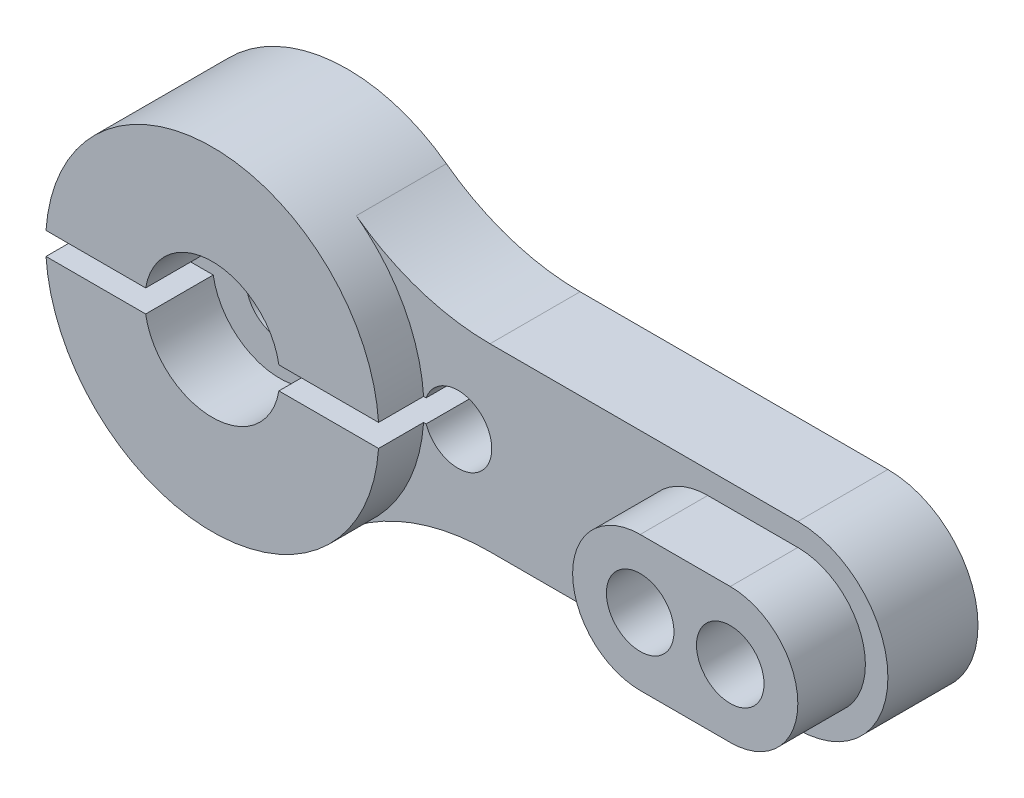
ISO-10303-21;
HEADER;
FILE_DESCRIPTION(('STEP AP214'),'2;1');
FILE_NAME('part.step','',(''),(''),'','','');
FILE_SCHEMA(('AUTOMOTIVE_DESIGN { 1 0 10303 214 1 1 1 1 }'));
ENDSEC;
DATA;
#1=APPLICATION_CONTEXT('core data for automotive mechanical design processes');
#2=APPLICATION_PROTOCOL_DEFINITION('international standard','automotive_design',2000,#1);
#3=PRODUCT_CONTEXT('',#1,'mechanical');
#4=PRODUCT('Part','Part','',(#3));
#5=PRODUCT_RELATED_PRODUCT_CATEGORY('part','',(#4));
#6=PRODUCT_DEFINITION_FORMATION('','',#4);
#7=PRODUCT_DEFINITION_CONTEXT('part definition',#1,'design');
#8=PRODUCT_DEFINITION('design','',#6,#7);
#9=PRODUCT_DEFINITION_SHAPE('','',#8);
#10=(LENGTH_UNIT() NAMED_UNIT(*) SI_UNIT(.MILLI.,.METRE.));
#11=(NAMED_UNIT(*) PLANE_ANGLE_UNIT() SI_UNIT($,.RADIAN.));
#12=(NAMED_UNIT(*) SI_UNIT($,.STERADIAN.) SOLID_ANGLE_UNIT());
#13=UNCERTAINTY_MEASURE_WITH_UNIT(LENGTH_MEASURE(1.E-05),#10,'distance_accuracy_value','');
#14=(GEOMETRIC_REPRESENTATION_CONTEXT(3) GLOBAL_UNCERTAINTY_ASSIGNED_CONTEXT((#13)) GLOBAL_UNIT_ASSIGNED_CONTEXT((#10,
#11,#12)) REPRESENTATION_CONTEXT('',''));
#15=CARTESIAN_POINT('',(0.,0.,0.));
#16=DIRECTION('',(0.,0.,1.));
#17=DIRECTION('',(1.,0.,0.));
#18=AXIS2_PLACEMENT_3D('',#15,#16,#17);
#19=CARTESIAN_POINT('',(0.,0.,7.));
#20=DIRECTION('',(0.,0.,-1.));
#21=DIRECTION('',(-1.,0.,0.));
#22=AXIS2_PLACEMENT_3D('',#19,#20,#21);
#23=CYLINDRICAL_SURFACE('',#22,1.5);
#24=CARTESIAN_POINT('',(0.,0.,1.5));
#25=DIRECTION('',(0.,0.,-1.));
#26=DIRECTION('',(-1.,0.,0.));
#27=AXIS2_PLACEMENT_3D('',#24,#25,#26);
#28=CIRCLE('',#27,1.5);
#29=CARTESIAN_POINT('',(1.4142135623731,0.5,1.5));
#30=VERTEX_POINT('',#29);
#31=CARTESIAN_POINT('',(1.4142135623731,-0.5,1.5));
#32=VERTEX_POINT('',#31);
#33=EDGE_CURVE('E82',#30,#32,#28,.F.);
#34=ORIENTED_EDGE('',*,*,#33,.F.);
#35=DIRECTION('',(0.,0.,-1.));
#36=VECTOR('',#35,1.);
#37=CARTESIAN_POINT('',(1.4142135623731,0.5,7.));
#38=LINE('',#37,#36);
#39=CARTESIAN_POINT('',(1.4142135623731,0.5,3.));
#40=VERTEX_POINT('',#39);
#41=EDGE_CURVE('E257',#40,#30,#38,.T.);
#42=ORIENTED_EDGE('',*,*,#41,.F.);
#43=CARTESIAN_POINT('',(0.,0.,3.));
#44=DIRECTION('',(0.,0.,1.));
#45=DIRECTION('',(1.,0.,0.));
#46=AXIS2_PLACEMENT_3D('',#43,#44,#45);
#47=CIRCLE('',#46,1.5);
#48=CARTESIAN_POINT('',(1.4142135623731,-0.5,3.));
#49=VERTEX_POINT('',#48);
#50=EDGE_CURVE('E424',#40,#49,#47,.T.);
#51=ORIENTED_EDGE('',*,*,#50,.T.);
#52=DIRECTION('',(0.,0.,-1.));
#53=VECTOR('',#52,1.);
#54=CARTESIAN_POINT('',(1.4142135623731,-0.5,7.));
#55=LINE('',#54,#53);
#56=EDGE_CURVE('E254',#49,#32,#55,.T.);
#57=ORIENTED_EDGE('',*,*,#56,.T.);
#58=EDGE_LOOP('',(#34,#42,#51,#57));
#59=FACE_BOUND('',#58,.T.);
#60=ADVANCED_FACE('F74',(#59),#23,.F.);
#61=CARTESIAN_POINT('',(0.,0.,6.));
#62=DIRECTION('',(0.,0.,1.));
#63=DIRECTION('',(1.,0.,0.));
#64=AXIS2_PLACEMENT_3D('',#61,#62,#63);
#65=PLANE('',#64);
#66=DIRECTION('',(-1.,0.,0.));
#67=VECTOR('',#66,1.);
#68=CARTESIAN_POINT('',(-2.95803989154981,0.499999999999999,6.));
#69=LINE('',#68,#67);
#70=CARTESIAN_POINT('',(-2.95803989154981,0.499999999999999,6.));
#71=VERTEX_POINT('',#70);
#72=CARTESIAN_POINT('',(-7.38308878451289,0.5,6.));
#73=VERTEX_POINT('',#72);
#74=EDGE_CURVE('E291',#71,#73,#69,.T.);
#75=ORIENTED_EDGE('',*,*,#74,.F.);
#76=CARTESIAN_POINT('',(0.,0.,6.));
#77=DIRECTION('',(0.,0.,1.));
#78=DIRECTION('',(1.,0.,0.));
#79=AXIS2_PLACEMENT_3D('',#76,#77,#78);
#80=CIRCLE('',#79,3.);
#81=CARTESIAN_POINT('',(2.95803989154981,0.499999999999999,6.));
#82=VERTEX_POINT('',#81);
#83=EDGE_CURVE('E303',#82,#71,#80,.T.);
#84=ORIENTED_EDGE('',*,*,#83,.F.);
#85=DIRECTION('',(-1.,0.,0.));
#86=VECTOR('',#85,1.);
#87=CARTESIAN_POINT('',(0.,0.499999999999999,6.));
#88=LINE('',#87,#86);
#89=CARTESIAN_POINT('',(7.38308878451289,0.499999999999998,6.));
#90=VERTEX_POINT('',#89);
#91=EDGE_CURVE('E420',#90,#82,#88,.T.);
#92=ORIENTED_EDGE('',*,*,#91,.F.);
#93=CARTESIAN_POINT('',(0.,0.,6.));
#94=DIRECTION('',(0.,0.,1.));
#95=DIRECTION('',(1.,0.,0.));
#96=AXIS2_PLACEMENT_3D('',#93,#94,#95);
#97=CIRCLE('',#96,7.4);
#98=EDGE_CURVE('E370',#90,#73,#97,.T.);
#99=ORIENTED_EDGE('',*,*,#98,.T.);
#100=EDGE_LOOP('',(#75,#84,#92,#99));
#101=FACE_BOUND('',#100,.T.);
#102=ADVANCED_FACE('F479',(#101),#65,.T.);
#103=CARTESIAN_POINT('',(10.3324730824716,-14.,4.));
#104=DIRECTION('',(0.,0.,-1.));
#105=DIRECTION('',(-1.,0.,0.));
#106=AXIS2_PLACEMENT_3D('',#103,#104,#105);
#107=PLANE('',#106);
#108=DIRECTION('',(1.,0.,0.));
#109=VECTOR('',#108,1.);
#110=CARTESIAN_POINT('',(10.3324730824716,0.499999999999999,4.));
#111=LINE('',#110,#109);
#112=CARTESIAN_POINT('',(7.38308878451289,0.499999999999998,4.));
#113=VERTEX_POINT('',#112);
#114=CARTESIAN_POINT('',(7.49578643762691,0.5,4.));
#115=VERTEX_POINT('',#114);
#116=EDGE_CURVE('E326',#113,#115,#111,.T.);
#117=ORIENTED_EDGE('',*,*,#116,.T.);
#118=CARTESIAN_POINT('',(8.91,0.,4.));
#119=DIRECTION('',(0.,0.,-1.));
#120=DIRECTION('',(-1.,0.,0.));
#121=AXIS2_PLACEMENT_3D('',#118,#119,#120);
#122=CIRCLE('',#121,1.5);
#123=CARTESIAN_POINT('',(7.4957864376269,-0.5,4.));
#124=VERTEX_POINT('',#123);
#125=EDGE_CURVE('E271',#115,#124,#122,.T.);
#126=ORIENTED_EDGE('',*,*,#125,.T.);
#127=DIRECTION('',(-1.,0.,0.));
#128=VECTOR('',#127,1.);
#129=CARTESIAN_POINT('',(10.3324730824716,-0.499999999999999,4.));
#130=LINE('',#129,#128);
#131=CARTESIAN_POINT('',(7.38308878451289,-0.499999999999998,4.));
#132=VERTEX_POINT('',#131);
#133=EDGE_CURVE('E320',#124,#132,#130,.T.);
#134=ORIENTED_EDGE('',*,*,#133,.T.);
#135=CARTESIAN_POINT('',(0.,0.,4.));
#136=DIRECTION('',(0.,0.,1.));
#137=DIRECTION('',(1.,0.,0.));
#138=AXIS2_PLACEMENT_3D('',#135,#136,#137);
#139=CIRCLE('',#138,7.4);
#140=CARTESIAN_POINT('',(4.39427016151091,-5.95402298850575,4.));
#141=VERTEX_POINT('',#140);
#142=EDGE_CURVE('E371',#141,#132,#139,.T.);
#143=ORIENTED_EDGE('',*,*,#142,.F.);
#144=CARTESIAN_POINT('',(10.3324730824716,-14.,4.));
#145=DIRECTION('',(0.,0.,-1.));
#146=DIRECTION('',(-1.,0.,0.));
#147=AXIS2_PLACEMENT_3D('',#144,#145,#146);
#148=CIRCLE('',#147,10.);
#149=CARTESIAN_POINT('',(10.3324730824716,-4.,4.));
#150=VERTEX_POINT('',#149);
#151=EDGE_CURVE('E376',#141,#150,#148,.T.);
#152=ORIENTED_EDGE('',*,*,#151,.T.);
#153=DIRECTION('',(1.,0.,0.));
#154=VECTOR('',#153,1.);
#155=CARTESIAN_POINT('',(24.,-4.,4.));
#156=LINE('',#155,#154);
#157=CARTESIAN_POINT('',(24.,-4.,4.));
#158=VERTEX_POINT('',#157);
#159=EDGE_CURVE('E379',#150,#158,#156,.T.);
#160=ORIENTED_EDGE('',*,*,#159,.T.);
#161=CARTESIAN_POINT('',(24.,0.,4.));
#162=DIRECTION('',(0.,0.,1.));
#163=DIRECTION('',(1.,0.,0.));
#164=AXIS2_PLACEMENT_3D('',#161,#162,#163);
#165=CIRCLE('',#164,4.);
#166=CARTESIAN_POINT('',(24.,4.,4.));
#167=VERTEX_POINT('',#166);
#168=EDGE_CURVE('E382',#158,#167,#165,.T.);
#169=ORIENTED_EDGE('',*,*,#168,.T.);
#170=DIRECTION('',(-1.,0.,0.));
#171=VECTOR('',#170,1.);
#172=CARTESIAN_POINT('',(24.,4.,4.));
#173=LINE('',#172,#171);
#174=CARTESIAN_POINT('',(10.3324730824716,4.,4.));
#175=VERTEX_POINT('',#174);
#176=EDGE_CURVE('E384',#167,#175,#173,.T.);
#177=ORIENTED_EDGE('',*,*,#176,.T.);
#178=CARTESIAN_POINT('',(10.3324730824716,14.,4.));
#179=DIRECTION('',(0.,0.,-1.));
#180=DIRECTION('',(-1.,0.,0.));
#181=AXIS2_PLACEMENT_3D('',#178,#179,#180);
#182=CIRCLE('',#181,10.);
#183=CARTESIAN_POINT('',(4.3942701615109,5.95402298850575,4.));
#184=VERTEX_POINT('',#183);
#185=EDGE_CURVE('E386',#175,#184,#182,.T.);
#186=ORIENTED_EDGE('',*,*,#185,.T.);
#187=EDGE_CURVE('E375',#113,#184,#139,.T.);
#188=ORIENTED_EDGE('',*,*,#187,.F.);
#189=EDGE_LOOP('',(#117,#126,#134,#143,#152,#160,#169,#177,#186,#188));
#190=FACE_BOUND('',#189,.T.);
#191=CARTESIAN_POINT('',(24.,0.,4.));
#192=DIRECTION('',(0.,0.,1.));
#193=DIRECTION('',(1.,0.,0.));
#194=AXIS2_PLACEMENT_3D('',#191,#192,#193);
#195=CIRCLE('',#194,3.);
#196=CARTESIAN_POINT('',(24.,-3.,4.));
#197=VERTEX_POINT('',#196);
#198=CARTESIAN_POINT('',(24.,3.,4.));
#199=VERTEX_POINT('',#198);
#200=EDGE_CURVE('E334',#197,#199,#195,.T.);
#201=ORIENTED_EDGE('',*,*,#200,.F.);
#202=DIRECTION('',(1.,0.,0.));
#203=VECTOR('',#202,1.);
#204=CARTESIAN_POINT('',(24.,-3.,4.));
#205=LINE('',#204,#203);
#206=CARTESIAN_POINT('',(20.,-3.,4.));
#207=VERTEX_POINT('',#206);
#208=EDGE_CURVE('E339',#207,#197,#205,.T.);
#209=ORIENTED_EDGE('',*,*,#208,.F.);
#210=CARTESIAN_POINT('',(20.,0.,4.));
#211=DIRECTION('',(0.,0.,1.));
#212=DIRECTION('',(1.,0.,0.));
#213=AXIS2_PLACEMENT_3D('',#210,#211,#212);
#214=CIRCLE('',#213,3.);
#215=CARTESIAN_POINT('',(20.,3.,4.));
#216=VERTEX_POINT('',#215);
#217=EDGE_CURVE('E351',#216,#207,#214,.T.);
#218=ORIENTED_EDGE('',*,*,#217,.F.);
#219=DIRECTION('',(-1.,0.,0.));
#220=VECTOR('',#219,1.);
#221=CARTESIAN_POINT('',(24.,3.,4.));
#222=LINE('',#221,#220);
#223=EDGE_CURVE('E348',#199,#216,#222,.T.);
#224=ORIENTED_EDGE('',*,*,#223,.F.);
#225=EDGE_LOOP('',(#201,#209,#218,#224));
#226=FACE_BOUND('',#225,.T.);
#227=ADVANCED_FACE('F455',(#190,#226),#107,.F.);
#228=CARTESIAN_POINT('',(10.3324730824716,-14.,4.));
#229=DIRECTION('',(0.,0.,-1.));
#230=DIRECTION('',(-1.,0.,0.));
#231=AXIS2_PLACEMENT_3D('',#228,#229,#230);
#232=CYLINDRICAL_SURFACE('',#231,10.);
#233=CARTESIAN_POINT('',(10.3324730824716,-14.,0.));
#234=DIRECTION('',(0.,0.,-1.));
#235=DIRECTION('',(-1.,0.,0.));
#236=AXIS2_PLACEMENT_3D('',#233,#234,#235);
#237=CIRCLE('',#236,10.);
#238=CARTESIAN_POINT('',(4.39427016151091,-5.95402298850575,0.));
#239=VERTEX_POINT('',#238);
#240=CARTESIAN_POINT('',(10.3324730824716,-4.,0.));
#241=VERTEX_POINT('',#240);
#242=EDGE_CURVE('E390',#239,#241,#237,.T.);
#243=ORIENTED_EDGE('',*,*,#242,.T.);
#244=DIRECTION('',(0.,0.,-1.));
#245=VECTOR('',#244,1.);
#246=CARTESIAN_POINT('',(10.3324730824716,-4.,4.));
#247=LINE('',#246,#245);
#248=EDGE_CURVE('E416',#150,#241,#247,.T.);
#249=ORIENTED_EDGE('',*,*,#248,.F.);
#250=ORIENTED_EDGE('',*,*,#151,.F.);
#251=DIRECTION('',(0.,0.,-1.));
#252=VECTOR('',#251,1.);
#253=CARTESIAN_POINT('',(4.39427016151091,-5.95402298850575,4.));
#254=LINE('',#253,#252);
#255=EDGE_CURVE('E389',#141,#239,#254,.T.);
#256=ORIENTED_EDGE('',*,*,#255,.T.);
#257=EDGE_LOOP('',(#243,#249,#250,#256));
#258=FACE_BOUND('',#257,.T.);
#259=ADVANCED_FACE('F76',(#258),#232,.F.);
#260=CARTESIAN_POINT('',(24.,-4.,4.));
#261=DIRECTION('',(0.,1.,0.));
#262=DIRECTION('',(-1.,0.,0.));
#263=AXIS2_PLACEMENT_3D('',#260,#261,#262);
#264=PLANE('',#263);
#265=DIRECTION('',(1.,0.,0.));
#266=VECTOR('',#265,1.);
#267=CARTESIAN_POINT('',(24.,-4.,0.));
#268=LINE('',#267,#266);
#269=CARTESIAN_POINT('',(24.,-4.,0.));
#270=VERTEX_POINT('',#269);
#271=EDGE_CURVE('E393',#241,#270,#268,.T.);
#272=ORIENTED_EDGE('',*,*,#271,.T.);
#273=DIRECTION('',(0.,0.,-1.));
#274=VECTOR('',#273,1.);
#275=CARTESIAN_POINT('',(24.,-4.,4.));
#276=LINE('',#275,#274);
#277=EDGE_CURVE('E413',#158,#270,#276,.T.);
#278=ORIENTED_EDGE('',*,*,#277,.F.);
#279=ORIENTED_EDGE('',*,*,#159,.F.);
#280=ORIENTED_EDGE('',*,*,#248,.T.);
#281=EDGE_LOOP('',(#272,#278,#279,#280));
#282=FACE_BOUND('',#281,.T.);
#283=ADVANCED_FACE('F513',(#282),#264,.F.);
#284=CARTESIAN_POINT('',(24.,0.,4.));
#285=DIRECTION('',(0.,0.,-1.));
#286=DIRECTION('',(-1.,0.,0.));
#287=AXIS2_PLACEMENT_3D('',#284,#285,#286);
#288=CYLINDRICAL_SURFACE('',#287,4.);
#289=CARTESIAN_POINT('',(24.,0.,0.));
#290=DIRECTION('',(0.,0.,1.));
#291=DIRECTION('',(1.,0.,0.));
#292=AXIS2_PLACEMENT_3D('',#289,#290,#291);
#293=CIRCLE('',#292,4.);
#294=CARTESIAN_POINT('',(24.,4.,0.));
#295=VERTEX_POINT('',#294);
#296=EDGE_CURVE('E395',#270,#295,#293,.T.);
#297=ORIENTED_EDGE('',*,*,#296,.T.);
#298=DIRECTION('',(0.,0.,-1.));
#299=VECTOR('',#298,1.);
#300=CARTESIAN_POINT('',(24.,4.,4.));
#301=LINE('',#300,#299);
#302=EDGE_CURVE('E410',#167,#295,#301,.T.);
#303=ORIENTED_EDGE('',*,*,#302,.F.);
#304=ORIENTED_EDGE('',*,*,#168,.F.);
#305=ORIENTED_EDGE('',*,*,#277,.T.);
#306=EDGE_LOOP('',(#297,#303,#304,#305));
#307=FACE_BOUND('',#306,.T.);
#308=ADVANCED_FACE('F510',(#307),#288,.T.);
#309=CARTESIAN_POINT('',(24.,4.,4.));
#310=DIRECTION('',(0.,-1.,0.));
#311=DIRECTION('',(1.,0.,0.));
#312=AXIS2_PLACEMENT_3D('',#309,#310,#311);
#313=PLANE('',#312);
#314=DIRECTION('',(-1.,0.,0.));
#315=VECTOR('',#314,1.);
#316=CARTESIAN_POINT('',(24.,4.,0.));
#317=LINE('',#316,#315);
#318=CARTESIAN_POINT('',(10.3324730824716,4.,0.));
#319=VERTEX_POINT('',#318);
#320=EDGE_CURVE('E397',#295,#319,#317,.T.);
#321=ORIENTED_EDGE('',*,*,#320,.T.);
#322=DIRECTION('',(0.,0.,-1.));
#323=VECTOR('',#322,1.);
#324=CARTESIAN_POINT('',(10.3324730824716,4.,4.));
#325=LINE('',#324,#323);
#326=EDGE_CURVE('E407',#175,#319,#325,.T.);
#327=ORIENTED_EDGE('',*,*,#326,.F.);
#328=ORIENTED_EDGE('',*,*,#176,.F.);
#329=ORIENTED_EDGE('',*,*,#302,.T.);
#330=EDGE_LOOP('',(#321,#327,#328,#329));
#331=FACE_BOUND('',#330,.T.);
#332=ADVANCED_FACE('F506',(#331),#313,.F.);
#333=CARTESIAN_POINT('',(10.3324730824716,14.,4.));
#334=DIRECTION('',(0.,0.,-1.));
#335=DIRECTION('',(-1.,0.,0.));
#336=AXIS2_PLACEMENT_3D('',#333,#334,#335);
#337=CYLINDRICAL_SURFACE('',#336,10.);
#338=CARTESIAN_POINT('',(10.3324730824716,14.,0.));
#339=DIRECTION('',(0.,0.,-1.));
#340=DIRECTION('',(-1.,0.,0.));
#341=AXIS2_PLACEMENT_3D('',#338,#339,#340);
#342=CIRCLE('',#341,10.);
#343=CARTESIAN_POINT('',(4.3942701615109,5.95402298850575,0.));
#344=VERTEX_POINT('',#343);
#345=EDGE_CURVE('E399',#319,#344,#342,.T.);
#346=ORIENTED_EDGE('',*,*,#345,.T.);
#347=DIRECTION('',(0.,0.,-1.));
#348=VECTOR('',#347,1.);
#349=CARTESIAN_POINT('',(4.3942701615109,5.95402298850575,4.));
#350=LINE('',#349,#348);
#351=EDGE_CURVE('E404',#184,#344,#350,.T.);
#352=ORIENTED_EDGE('',*,*,#351,.F.);
#353=ORIENTED_EDGE('',*,*,#185,.F.);
#354=ORIENTED_EDGE('',*,*,#326,.T.);
#355=EDGE_LOOP('',(#346,#352,#353,#354));
#356=FACE_BOUND('',#355,.T.);
#357=ADVANCED_FACE('F501',(#356),#337,.F.);
#358=CARTESIAN_POINT('',(0.,0.,4.));
#359=DIRECTION('',(0.,0.,-1.));
#360=DIRECTION('',(-1.,0.,0.));
#361=AXIS2_PLACEMENT_3D('',#358,#359,#360);
#362=CYLINDRICAL_SURFACE('',#361,7.4);
#363=ORIENTED_EDGE('',*,*,#98,.F.);
#364=DIRECTION('',(0.,0.,-1.));
#365=VECTOR('',#364,1.);
#366=CARTESIAN_POINT('',(7.38308878451289,0.499999999999998,4.));
#367=LINE('',#366,#365);
#368=EDGE_CURVE('E323',#90,#113,#367,.T.);
#369=ORIENTED_EDGE('',*,*,#368,.T.);
#370=ORIENTED_EDGE('',*,*,#187,.T.);
#371=ORIENTED_EDGE('',*,*,#351,.T.);
#372=CARTESIAN_POINT('',(0.,0.,0.));
#373=DIRECTION('',(0.,0.,1.));
#374=DIRECTION('',(1.,0.,0.));
#375=AXIS2_PLACEMENT_3D('',#372,#373,#374);
#376=CIRCLE('',#375,7.4);
#377=EDGE_CURVE('E380',#344,#239,#376,.T.);
#378=ORIENTED_EDGE('',*,*,#377,.T.);
#379=ORIENTED_EDGE('',*,*,#255,.F.);
#380=ORIENTED_EDGE('',*,*,#142,.T.);
#381=DIRECTION('',(0.,0.,-1.));
#382=VECTOR('',#381,1.);
#383=CARTESIAN_POINT('',(7.38308878451289,-0.499999999999998,4.));
#384=LINE('',#383,#382);
#385=CARTESIAN_POINT('',(7.38308878451289,-0.499999999999998,6.));
#386=VERTEX_POINT('',#385);
#387=EDGE_CURVE('E310',#132,#386,#384,.F.);
#388=ORIENTED_EDGE('',*,*,#387,.T.);
#389=CARTESIAN_POINT('',(-7.38308878451289,-0.5,6.));
#390=VERTEX_POINT('',#389);
#391=EDGE_CURVE('E367',#390,#386,#97,.T.);
#392=ORIENTED_EDGE('',*,*,#391,.F.);
#393=DIRECTION('',(0.,0.,-1.));
#394=VECTOR('',#393,1.);
#395=CARTESIAN_POINT('',(-7.38308878451289,-0.5,4.));
#396=LINE('',#395,#394);
#397=CARTESIAN_POINT('',(-7.38308878451289,-0.5,3.));
#398=VERTEX_POINT('',#397);
#399=EDGE_CURVE('E331',#390,#398,#396,.T.);
#400=ORIENTED_EDGE('',*,*,#399,.T.);
#401=CARTESIAN_POINT('',(0.,0.,3.));
#402=DIRECTION('',(0.,0.,1.));
#403=DIRECTION('',(1.,0.,0.));
#404=AXIS2_PLACEMENT_3D('',#401,#402,#403);
#405=CIRCLE('',#404,7.4);
#406=CARTESIAN_POINT('',(-7.38308878451289,0.5,3.));
#407=VERTEX_POINT('',#406);
#408=EDGE_CURVE('E422',#407,#398,#405,.T.);
#409=ORIENTED_EDGE('',*,*,#408,.F.);
#410=DIRECTION('',(0.,0.,-1.));
#411=VECTOR('',#410,1.);
#412=CARTESIAN_POINT('',(-7.38308878451289,0.5,4.));
#413=LINE('',#412,#411);
#414=EDGE_CURVE('E328',#407,#73,#413,.F.);
#415=ORIENTED_EDGE('',*,*,#414,.T.);
#416=EDGE_LOOP('',(#363,#369,#370,#371,#378,#379,#380,#388,#392,#400,#409,#415));
#417=FACE_BOUND('',#416,.T.);
#418=ADVANCED_FACE('F451',(#417),#362,.T.);
#419=CARTESIAN_POINT('',(10.3324730824716,-14.,0.));
#420=DIRECTION('',(0.,0.,-1.));
#421=DIRECTION('',(-1.,0.,0.));
#422=AXIS2_PLACEMENT_3D('',#419,#420,#421);
#423=PLANE('',#422);
#424=CARTESIAN_POINT('',(0.,0.,0.));
#425=DIRECTION('',(0.,0.,-1.));
#426=DIRECTION('',(-1.,0.,0.));
#427=AXIS2_PLACEMENT_3D('',#424,#425,#426);
#428=CIRCLE('',#427,3.925);
#429=CARTESIAN_POINT('',(3.89302260460943,-0.499999999999999,0.));
#430=VERTEX_POINT('',#429);
#431=CARTESIAN_POINT('',(3.89302260460943,0.499999999999999,0.));
#432=VERTEX_POINT('',#431);
#433=EDGE_CURVE('E236',#430,#432,#428,.T.);
#434=ORIENTED_EDGE('',*,*,#433,.F.);
#435=DIRECTION('',(1.,0.,0.));
#436=VECTOR('',#435,1.);
#437=CARTESIAN_POINT('',(0.,-0.5,0.));
#438=LINE('',#437,#436);
#439=CARTESIAN_POINT('',(7.4957864376269,-0.5,0.));
#440=VERTEX_POINT('',#439);
#441=EDGE_CURVE('E97',#430,#440,#438,.T.);
#442=ORIENTED_EDGE('',*,*,#441,.T.);
#443=CARTESIAN_POINT('',(8.91,0.,0.));
#444=DIRECTION('',(0.,0.,-1.));
#445=DIRECTION('',(-1.,0.,0.));
#446=AXIS2_PLACEMENT_3D('',#443,#444,#445);
#447=CIRCLE('',#446,1.5);
#448=CARTESIAN_POINT('',(7.49578643762691,0.5,0.));
#449=VERTEX_POINT('',#448);
#450=EDGE_CURVE('E253',#449,#440,#447,.T.);
#451=ORIENTED_EDGE('',*,*,#450,.F.);
#452=DIRECTION('',(1.,0.,0.));
#453=VECTOR('',#452,1.);
#454=CARTESIAN_POINT('',(0.,0.5,0.));
#455=LINE('',#454,#453);
#456=EDGE_CURVE('E247',#432,#449,#455,.T.);
#457=ORIENTED_EDGE('',*,*,#456,.F.);
#458=EDGE_LOOP('',(#434,#442,#451,#457));
#459=FACE_BOUND('',#458,.T.);
#460=CARTESIAN_POINT('',(24.,0.,0.));
#461=DIRECTION('',(0.,0.,1.));
#462=DIRECTION('',(-1.,0.,0.));
#463=AXIS2_PLACEMENT_3D('',#460,#461,#462);
#464=CIRCLE('',#463,1.5);
#465=CARTESIAN_POINT('',(22.5,0.,0.));
#466=VERTEX_POINT('',#465);
#467=EDGE_CURVE('E275',#466,#466,#464,.T.);
#468=ORIENTED_EDGE('',*,*,#467,.T.);
#469=EDGE_LOOP('',(#468));
#470=FACE_BOUND('',#469,.T.);
#471=CARTESIAN_POINT('',(20.,0.,0.));
#472=DIRECTION('',(0.,0.,1.));
#473=DIRECTION('',(1.,0.,0.));
#474=AXIS2_PLACEMENT_3D('',#471,#472,#473);
#475=CIRCLE('',#474,1.5);
#476=CARTESIAN_POINT('',(21.5,0.,0.));
#477=VERTEX_POINT('',#476);
#478=EDGE_CURVE('E281',#477,#477,#475,.T.);
#479=ORIENTED_EDGE('',*,*,#478,.T.);
#480=EDGE_LOOP('',(#479));
#481=FACE_BOUND('',#480,.T.);
#482=ORIENTED_EDGE('',*,*,#242,.F.);
#483=ORIENTED_EDGE('',*,*,#377,.F.);
#484=ORIENTED_EDGE('',*,*,#345,.F.);
#485=ORIENTED_EDGE('',*,*,#320,.F.);
#486=ORIENTED_EDGE('',*,*,#296,.F.);
#487=ORIENTED_EDGE('',*,*,#271,.F.);
#488=EDGE_LOOP('',(#482,#483,#484,#485,#486,#487));
#489=FACE_BOUND('',#488,.T.);
#490=ADVANCED_FACE('F251',(#459,#470,#481,#489),#423,.T.);
#491=DIRECTION('',(1.,0.,0.));
#492=VECTOR('',#491,1.);
#493=CARTESIAN_POINT('',(0.,-0.499999999999999,6.));
#494=LINE('',#493,#492);
#495=CARTESIAN_POINT('',(-2.95803989154981,-0.499999999999999,6.));
#496=VERTEX_POINT('',#495);
#497=EDGE_CURVE('E374',#390,#496,#494,.T.);
#498=ORIENTED_EDGE('',*,*,#497,.F.);
#499=ORIENTED_EDGE('',*,*,#391,.T.);
#500=DIRECTION('',(1.,0.,0.));
#501=VECTOR('',#500,1.);
#502=CARTESIAN_POINT('',(7.39999999999997,-0.499999999999998,6.));
#503=LINE('',#502,#501);
#504=CARTESIAN_POINT('',(2.95803989154981,-0.499999999999999,6.));
#505=VERTEX_POINT('',#504);
#506=EDGE_CURVE('E301',#505,#386,#503,.T.);
#507=ORIENTED_EDGE('',*,*,#506,.F.);
#508=CARTESIAN_POINT('',(0.,0.,6.));
#509=DIRECTION('',(0.,0.,1.));
#510=DIRECTION('',(1.,0.,0.));
#511=AXIS2_PLACEMENT_3D('',#508,#509,#510);
#512=CIRCLE('',#511,3.);
#513=EDGE_CURVE('E284',#496,#505,#512,.T.);
#514=ORIENTED_EDGE('',*,*,#513,.F.);
#515=EDGE_LOOP('',(#498,#499,#507,#514));
#516=FACE_BOUND('',#515,.T.);
#517=ADVANCED_FACE('F447',(#516),#65,.T.);
#518=CARTESIAN_POINT('',(24.,0.,7.));
#519=DIRECTION('',(0.,0.,-1.));
#520=DIRECTION('',(-1.,0.,0.));
#521=AXIS2_PLACEMENT_3D('',#518,#519,#520);
#522=CYLINDRICAL_SURFACE('',#521,3.);
#523=ORIENTED_EDGE('',*,*,#200,.T.);
#524=DIRECTION('',(0.,0.,-1.));
#525=VECTOR('',#524,1.);
#526=CARTESIAN_POINT('',(24.,3.,7.));
#527=LINE('',#526,#525);
#528=CARTESIAN_POINT('',(24.,3.,7.));
#529=VERTEX_POINT('',#528);
#530=EDGE_CURVE('E364',#529,#199,#527,.T.);
#531=ORIENTED_EDGE('',*,*,#530,.F.);
#532=CARTESIAN_POINT('',(24.,0.,7.));
#533=DIRECTION('',(0.,0.,1.));
#534=DIRECTION('',(1.,0.,0.));
#535=AXIS2_PLACEMENT_3D('',#532,#533,#534);
#536=CIRCLE('',#535,3.);
#537=CARTESIAN_POINT('',(24.,-3.,7.));
#538=VERTEX_POINT('',#537);
#539=EDGE_CURVE('E335',#538,#529,#536,.T.);
#540=ORIENTED_EDGE('',*,*,#539,.F.);
#541=DIRECTION('',(0.,0.,-1.));
#542=VECTOR('',#541,1.);
#543=CARTESIAN_POINT('',(24.,-3.,7.));
#544=LINE('',#543,#542);
#545=EDGE_CURVE('E345',#538,#197,#544,.T.);
#546=ORIENTED_EDGE('',*,*,#545,.T.);
#547=EDGE_LOOP('',(#523,#531,#540,#546));
#548=FACE_BOUND('',#547,.T.);
#549=ADVANCED_FACE('F490',(#548),#522,.T.);
#550=CARTESIAN_POINT('',(24.,3.,7.));
#551=DIRECTION('',(0.,-1.,0.));
#552=DIRECTION('',(0.,0.,-1.));
#553=AXIS2_PLACEMENT_3D('',#550,#551,#552);
#554=PLANE('',#553);
#555=ORIENTED_EDGE('',*,*,#223,.T.);
#556=DIRECTION('',(0.,0.,-1.));
#557=VECTOR('',#556,1.);
#558=CARTESIAN_POINT('',(20.,3.,7.));
#559=LINE('',#558,#557);
#560=CARTESIAN_POINT('',(20.,3.,7.));
#561=VERTEX_POINT('',#560);
#562=EDGE_CURVE('E361',#561,#216,#559,.T.);
#563=ORIENTED_EDGE('',*,*,#562,.F.);
#564=DIRECTION('',(-1.,0.,0.));
#565=VECTOR('',#564,1.);
#566=CARTESIAN_POINT('',(24.,3.,7.));
#567=LINE('',#566,#565);
#568=EDGE_CURVE('E338',#529,#561,#567,.T.);
#569=ORIENTED_EDGE('',*,*,#568,.F.);
#570=ORIENTED_EDGE('',*,*,#530,.T.);
#571=EDGE_LOOP('',(#555,#563,#569,#570));
#572=FACE_BOUND('',#571,.T.);
#573=ADVANCED_FACE('F495',(#572),#554,.F.);
#574=CARTESIAN_POINT('',(20.,0.,7.));
#575=DIRECTION('',(0.,0.,-1.));
#576=DIRECTION('',(-1.,0.,0.));
#577=AXIS2_PLACEMENT_3D('',#574,#575,#576);
#578=CYLINDRICAL_SURFACE('',#577,3.);
#579=ORIENTED_EDGE('',*,*,#217,.T.);
#580=DIRECTION('',(0.,0.,-1.));
#581=VECTOR('',#580,1.);
#582=CARTESIAN_POINT('',(20.,-3.,7.));
#583=LINE('',#582,#581);
#584=CARTESIAN_POINT('',(20.,-3.,7.));
#585=VERTEX_POINT('',#584);
#586=EDGE_CURVE('E358',#585,#207,#583,.T.);
#587=ORIENTED_EDGE('',*,*,#586,.F.);
#588=CARTESIAN_POINT('',(20.,0.,7.));
#589=DIRECTION('',(0.,0.,1.));
#590=DIRECTION('',(1.,0.,0.));
#591=AXIS2_PLACEMENT_3D('',#588,#589,#590);
#592=CIRCLE('',#591,3.);
#593=EDGE_CURVE('E341',#561,#585,#592,.T.);
#594=ORIENTED_EDGE('',*,*,#593,.F.);
#595=ORIENTED_EDGE('',*,*,#562,.T.);
#596=EDGE_LOOP('',(#579,#587,#594,#595));
#597=FACE_BOUND('',#596,.T.);
#598=ADVANCED_FACE('F656',(#597),#578,.T.);
#599=CARTESIAN_POINT('',(24.,-3.,7.));
#600=DIRECTION('',(0.,1.,0.));
#601=DIRECTION('',(-1.,0.,0.));
#602=AXIS2_PLACEMENT_3D('',#599,#600,#601);
#603=PLANE('',#602);
#604=ORIENTED_EDGE('',*,*,#208,.T.);
#605=ORIENTED_EDGE('',*,*,#545,.F.);
#606=DIRECTION('',(1.,0.,0.));
#607=VECTOR('',#606,1.);
#608=CARTESIAN_POINT('',(24.,-3.,7.));
#609=LINE('',#608,#607);
#610=EDGE_CURVE('E343',#585,#538,#609,.T.);
#611=ORIENTED_EDGE('',*,*,#610,.F.);
#612=ORIENTED_EDGE('',*,*,#586,.T.);
#613=EDGE_LOOP('',(#604,#605,#611,#612));
#614=FACE_BOUND('',#613,.T.);
#615=ADVANCED_FACE('F652',(#614),#603,.F.);
#616=CARTESIAN_POINT('',(24.,0.,7.));
#617=DIRECTION('',(0.,0.,1.));
#618=DIRECTION('',(1.,0.,0.));
#619=AXIS2_PLACEMENT_3D('',#616,#617,#618);
#620=PLANE('',#619);
#621=CARTESIAN_POINT('',(24.,0.,7.));
#622=DIRECTION('',(0.,0.,1.));
#623=DIRECTION('',(-1.,0.,0.));
#624=AXIS2_PLACEMENT_3D('',#621,#622,#623);
#625=CIRCLE('',#624,1.5);
#626=CARTESIAN_POINT('',(22.5,0.,7.));
#627=VERTEX_POINT('',#626);
#628=EDGE_CURVE('E274',#627,#627,#625,.T.);
#629=ORIENTED_EDGE('',*,*,#628,.F.);
#630=EDGE_LOOP('',(#629));
#631=FACE_BOUND('',#630,.T.);
#632=CARTESIAN_POINT('',(20.,0.,7.));
#633=DIRECTION('',(0.,0.,1.));
#634=DIRECTION('',(1.,0.,0.));
#635=AXIS2_PLACEMENT_3D('',#632,#633,#634);
#636=CIRCLE('',#635,1.5);
#637=CARTESIAN_POINT('',(21.5,0.,7.));
#638=VERTEX_POINT('',#637);
#639=EDGE_CURVE('E278',#638,#638,#636,.T.);
#640=ORIENTED_EDGE('',*,*,#639,.F.);
#641=EDGE_LOOP('',(#640));
#642=FACE_BOUND('',#641,.T.);
#643=ORIENTED_EDGE('',*,*,#539,.T.);
#644=ORIENTED_EDGE('',*,*,#568,.T.);
#645=ORIENTED_EDGE('',*,*,#593,.T.);
#646=ORIENTED_EDGE('',*,*,#610,.T.);
#647=EDGE_LOOP('',(#643,#644,#645,#646));
#648=FACE_BOUND('',#647,.T.);
#649=ADVANCED_FACE('F561',(#631,#642,#648),#620,.T.);
#650=CARTESIAN_POINT('',(0.,0.,3.));
#651=DIRECTION('',(0.,0.,1.));
#652=DIRECTION('',(1.,0.,0.));
#653=AXIS2_PLACEMENT_3D('',#650,#651,#652);
#654=PLANE('',#653);
#655=DIRECTION('',(-1.,0.,0.));
#656=VECTOR('',#655,1.);
#657=CARTESIAN_POINT('',(0.,0.5,3.));
#658=LINE('',#657,#656);
#659=CARTESIAN_POINT('',(2.95803989154981,0.5,3.));
#660=VERTEX_POINT('',#659);
#661=EDGE_CURVE('E266',#660,#40,#658,.T.);
#662=ORIENTED_EDGE('',*,*,#661,.F.);
#663=CARTESIAN_POINT('',(0.,0.,3.));
#664=DIRECTION('',(0.,0.,1.));
#665=DIRECTION('',(1.,0.,0.));
#666=AXIS2_PLACEMENT_3D('',#663,#664,#665);
#667=CIRCLE('',#666,3.);
#668=CARTESIAN_POINT('',(-2.95803989154981,0.499999999999999,3.));
#669=VERTEX_POINT('',#668);
#670=EDGE_CURVE('E290',#660,#669,#667,.T.);
#671=ORIENTED_EDGE('',*,*,#670,.T.);
#672=DIRECTION('',(-1.,0.,0.));
#673=VECTOR('',#672,1.);
#674=CARTESIAN_POINT('',(-2.95803989154981,0.499999999999999,3.));
#675=LINE('',#674,#673);
#676=EDGE_CURVE('E294',#669,#407,#675,.T.);
#677=ORIENTED_EDGE('',*,*,#676,.T.);
#678=ORIENTED_EDGE('',*,*,#408,.T.);
#679=DIRECTION('',(1.,0.,0.));
#680=VECTOR('',#679,1.);
#681=CARTESIAN_POINT('',(-2.95803989154981,-0.499999999999999,3.));
#682=LINE('',#681,#680);
#683=CARTESIAN_POINT('',(-2.95803989154981,-0.499999999999999,3.));
#684=VERTEX_POINT('',#683);
#685=EDGE_CURVE('E297',#398,#684,#682,.T.);
#686=ORIENTED_EDGE('',*,*,#685,.T.);
#687=CARTESIAN_POINT('',(0.,0.,3.));
#688=DIRECTION('',(0.,0.,1.));
#689=DIRECTION('',(1.,0.,0.));
#690=AXIS2_PLACEMENT_3D('',#687,#688,#689);
#691=CIRCLE('',#690,3.);
#692=CARTESIAN_POINT('',(2.95803989154981,-0.5,3.));
#693=VERTEX_POINT('',#692);
#694=EDGE_CURVE('E287',#684,#693,#691,.T.);
#695=ORIENTED_EDGE('',*,*,#694,.T.);
#696=DIRECTION('',(-1.,0.,0.));
#697=VECTOR('',#696,1.);
#698=CARTESIAN_POINT('',(0.,-0.5,3.));
#699=LINE('',#698,#697);
#700=EDGE_CURVE('E268',#693,#49,#699,.T.);
#701=ORIENTED_EDGE('',*,*,#700,.T.);
#702=ORIENTED_EDGE('',*,*,#50,.F.);
#703=EDGE_LOOP('',(#662,#671,#677,#678,#686,#695,#701,#702));
#704=FACE_BOUND('',#703,.T.);
#705=ADVANCED_FACE('F436',(#704),#654,.T.);
#706=CARTESIAN_POINT('',(-2.95803989154981,-0.499999999999999,3.));
#707=DIRECTION('',(0.,-1.,0.));
#708=DIRECTION('',(1.,0.,0.));
#709=AXIS2_PLACEMENT_3D('',#706,#707,#708);
#710=PLANE('',#709);
#711=ORIENTED_EDGE('',*,*,#497,.T.);
#712=DIRECTION('',(0.,0.,1.));
#713=VECTOR('',#712,1.);
#714=CARTESIAN_POINT('',(-2.95803989154981,-0.499999999999999,3.));
#715=LINE('',#714,#713);
#716=EDGE_CURVE('E307',#684,#496,#715,.T.);
#717=ORIENTED_EDGE('',*,*,#716,.F.);
#718=ORIENTED_EDGE('',*,*,#685,.F.);
#719=ORIENTED_EDGE('',*,*,#399,.F.);
#720=EDGE_LOOP('',(#711,#717,#718,#719));
#721=FACE_BOUND('',#720,.T.);
#722=ADVANCED_FACE('F560',(#721),#710,.F.);
#723=CARTESIAN_POINT('',(-2.95803989154981,0.499999999999999,3.));
#724=DIRECTION('',(0.,1.,0.));
#725=DIRECTION('',(-1.,0.,0.));
#726=AXIS2_PLACEMENT_3D('',#723,#724,#725);
#727=PLANE('',#726);
#728=ORIENTED_EDGE('',*,*,#676,.F.);
#729=DIRECTION('',(0.,0.,1.));
#730=VECTOR('',#729,1.);
#731=CARTESIAN_POINT('',(-2.95803989154981,0.499999999999999,3.));
#732=LINE('',#731,#730);
#733=EDGE_CURVE('E311',#669,#71,#732,.T.);
#734=ORIENTED_EDGE('',*,*,#733,.T.);
#735=ORIENTED_EDGE('',*,*,#74,.T.);
#736=ORIENTED_EDGE('',*,*,#414,.F.);
#737=EDGE_LOOP('',(#728,#734,#735,#736));
#738=FACE_BOUND('',#737,.T.);
#739=ADVANCED_FACE('F475',(#738),#727,.F.);
#740=CARTESIAN_POINT('',(7.39999999999997,0.499999999999998,3.));
#741=DIRECTION('',(0.,1.,0.));
#742=DIRECTION('',(-1.,0.,0.));
#743=AXIS2_PLACEMENT_3D('',#740,#741,#742);
#744=PLANE('',#743);
#745=DIRECTION('',(-1.,0.,0.));
#746=VECTOR('',#745,1.);
#747=CARTESIAN_POINT('',(7.39999999999997,0.499999999999998,1.5));
#748=LINE('',#747,#746);
#749=CARTESIAN_POINT('',(3.89302260460943,0.499999999999999,1.5));
#750=VERTEX_POINT('',#749);
#751=EDGE_CURVE('E89',#750,#30,#748,.T.);
#752=ORIENTED_EDGE('',*,*,#751,.F.);
#753=DIRECTION('',(0.,0.,-1.));
#754=VECTOR('',#753,1.);
#755=CARTESIAN_POINT('',(3.89302260460943,0.499999999999999,1.5));
#756=LINE('',#755,#754);
#757=EDGE_CURVE('E240',#750,#432,#756,.T.);
#758=ORIENTED_EDGE('',*,*,#757,.T.);
#759=ORIENTED_EDGE('',*,*,#456,.T.);
#760=DIRECTION('',(0.,0.,-1.));
#761=VECTOR('',#760,1.);
#762=CARTESIAN_POINT('',(7.49578643762691,0.5,7.));
#763=LINE('',#762,#761);
#764=EDGE_CURVE('E261',#115,#449,#763,.T.);
#765=ORIENTED_EDGE('',*,*,#764,.F.);
#766=ORIENTED_EDGE('',*,*,#116,.F.);
#767=ORIENTED_EDGE('',*,*,#368,.F.);
#768=ORIENTED_EDGE('',*,*,#91,.T.);
#769=DIRECTION('',(0.,0.,1.));
#770=VECTOR('',#769,1.);
#771=CARTESIAN_POINT('',(2.95803989154981,0.499999999999999,3.));
#772=LINE('',#771,#770);
#773=EDGE_CURVE('E313',#660,#82,#772,.T.);
#774=ORIENTED_EDGE('',*,*,#773,.F.);
#775=ORIENTED_EDGE('',*,*,#661,.T.);
#776=ORIENTED_EDGE('',*,*,#41,.T.);
#777=EDGE_LOOP('',(#752,#758,#759,#765,#766,#767,#768,#774,#775,#776));
#778=FACE_BOUND('',#777,.T.);
#779=ADVANCED_FACE('F245',(#778),#744,.F.);
#780=CARTESIAN_POINT('',(7.39999999999997,-0.499999999999998,3.));
#781=DIRECTION('',(0.,-1.,0.));
#782=DIRECTION('',(1.,0.,0.));
#783=AXIS2_PLACEMENT_3D('',#780,#781,#782);
#784=PLANE('',#783);
#785=ORIENTED_EDGE('',*,*,#441,.F.);
#786=DIRECTION('',(0.,0.,-1.));
#787=VECTOR('',#786,1.);
#788=CARTESIAN_POINT('',(3.89302260460943,-0.499999999999999,1.5));
#789=LINE('',#788,#787);
#790=CARTESIAN_POINT('',(3.89302260460943,-0.499999999999999,1.5));
#791=VERTEX_POINT('',#790);
#792=EDGE_CURVE('E12',#430,#791,#789,.F.);
#793=ORIENTED_EDGE('',*,*,#792,.T.);
#794=DIRECTION('',(1.,0.,0.));
#795=VECTOR('',#794,1.);
#796=CARTESIAN_POINT('',(7.39999999999997,-0.499999999999998,1.5));
#797=LINE('',#796,#795);
#798=EDGE_CURVE('E427',#32,#791,#797,.T.);
#799=ORIENTED_EDGE('',*,*,#798,.F.);
#800=ORIENTED_EDGE('',*,*,#56,.F.);
#801=ORIENTED_EDGE('',*,*,#700,.F.);
#802=DIRECTION('',(0.,0.,1.));
#803=VECTOR('',#802,1.);
#804=CARTESIAN_POINT('',(2.95803989154981,-0.499999999999999,3.));
#805=LINE('',#804,#803);
#806=EDGE_CURVE('E299',#693,#505,#805,.T.);
#807=ORIENTED_EDGE('',*,*,#806,.T.);
#808=ORIENTED_EDGE('',*,*,#506,.T.);
#809=ORIENTED_EDGE('',*,*,#387,.F.);
#810=ORIENTED_EDGE('',*,*,#133,.F.);
#811=DIRECTION('',(0.,0.,-1.));
#812=VECTOR('',#811,1.);
#813=CARTESIAN_POINT('',(7.4957864376269,-0.5,7.));
#814=LINE('',#813,#812);
#815=EDGE_CURVE('E263',#124,#440,#814,.T.);
#816=ORIENTED_EDGE('',*,*,#815,.T.);
#817=EDGE_LOOP('',(#785,#793,#799,#800,#801,#807,#808,#809,#810,#816));
#818=FACE_BOUND('',#817,.T.);
#819=ADVANCED_FACE('F432',(#818),#784,.F.);
#820=CARTESIAN_POINT('',(0.,0.,3.));
#821=DIRECTION('',(0.,0.,1.));
#822=DIRECTION('',(1.,0.,0.));
#823=AXIS2_PLACEMENT_3D('',#820,#821,#822);
#824=CYLINDRICAL_SURFACE('',#823,3.);
#825=ORIENTED_EDGE('',*,*,#513,.T.);
#826=ORIENTED_EDGE('',*,*,#806,.F.);
#827=ORIENTED_EDGE('',*,*,#694,.F.);
#828=ORIENTED_EDGE('',*,*,#716,.T.);
#829=EDGE_LOOP('',(#825,#826,#827,#828));
#830=FACE_BOUND('',#829,.T.);
#831=ADVANCED_FACE('F442',(#830),#824,.F.);
#832=CARTESIAN_POINT('',(0.,0.,3.));
#833=DIRECTION('',(0.,0.,1.));
#834=DIRECTION('',(1.,0.,0.));
#835=AXIS2_PLACEMENT_3D('',#832,#833,#834);
#836=CYLINDRICAL_SURFACE('',#835,3.);
#837=ORIENTED_EDGE('',*,*,#83,.T.);
#838=ORIENTED_EDGE('',*,*,#733,.F.);
#839=ORIENTED_EDGE('',*,*,#670,.F.);
#840=ORIENTED_EDGE('',*,*,#773,.T.);
#841=EDGE_LOOP('',(#837,#838,#839,#840));
#842=FACE_BOUND('',#841,.T.);
#843=ADVANCED_FACE('F470',(#842),#836,.F.);
#844=CARTESIAN_POINT('',(20.,0.,0.));
#845=DIRECTION('',(0.,0.,1.));
#846=DIRECTION('',(1.,0.,0.));
#847=AXIS2_PLACEMENT_3D('',#844,#845,#846);
#848=CYLINDRICAL_SURFACE('',#847,1.5);
#849=ORIENTED_EDGE('',*,*,#478,.F.);
#850=EDGE_LOOP('',(#849));
#851=FACE_BOUND('',#850,.T.);
#852=ORIENTED_EDGE('',*,*,#639,.T.);
#853=EDGE_LOOP('',(#852));
#854=FACE_BOUND('',#853,.T.);
#855=ADVANCED_FACE('F584',(#851,#854),#848,.F.);
#856=CARTESIAN_POINT('',(24.,0.,0.));
#857=DIRECTION('',(0.,0.,1.));
#858=DIRECTION('',(1.,0.,0.));
#859=AXIS2_PLACEMENT_3D('',#856,#857,#858);
#860=CYLINDRICAL_SURFACE('',#859,1.5);
#861=ORIENTED_EDGE('',*,*,#467,.F.);
#862=EDGE_LOOP('',(#861));
#863=FACE_BOUND('',#862,.T.);
#864=ORIENTED_EDGE('',*,*,#628,.T.);
#865=EDGE_LOOP('',(#864));
#866=FACE_BOUND('',#865,.T.);
#867=ADVANCED_FACE('F551',(#863,#866),#860,.F.);
#868=CARTESIAN_POINT('',(8.91,0.,7.));
#869=DIRECTION('',(0.,0.,-1.));
#870=DIRECTION('',(-1.,0.,0.));
#871=AXIS2_PLACEMENT_3D('',#868,#869,#870);
#872=CYLINDRICAL_SURFACE('',#871,1.5);
#873=ORIENTED_EDGE('',*,*,#764,.T.);
#874=ORIENTED_EDGE('',*,*,#450,.T.);
#875=ORIENTED_EDGE('',*,*,#815,.F.);
#876=ORIENTED_EDGE('',*,*,#125,.F.);
#877=EDGE_LOOP('',(#873,#874,#875,#876));
#878=FACE_BOUND('',#877,.T.);
#879=ADVANCED_FACE('F461',(#878),#872,.F.);
#880=CARTESIAN_POINT('',(0.,0.,1.5));
#881=DIRECTION('',(0.,0.,-1.));
#882=DIRECTION('',(-1.,0.,0.));
#883=AXIS2_PLACEMENT_3D('',#880,#881,#882);
#884=CYLINDRICAL_SURFACE('',#883,3.925);
#885=CARTESIAN_POINT('',(0.,0.,1.5));
#886=DIRECTION('',(0.,0.,-1.));
#887=DIRECTION('',(-1.,0.,0.));
#888=AXIS2_PLACEMENT_3D('',#885,#886,#887);
#889=CIRCLE('',#888,3.925);
#890=EDGE_CURVE('E242',#791,#750,#889,.T.);
#891=ORIENTED_EDGE('',*,*,#890,.F.);
#892=ORIENTED_EDGE('',*,*,#792,.F.);
#893=ORIENTED_EDGE('',*,*,#433,.T.);
#894=ORIENTED_EDGE('',*,*,#757,.F.);
#895=EDGE_LOOP('',(#891,#892,#893,#894));
#896=FACE_BOUND('',#895,.T.);
#897=ADVANCED_FACE('F239',(#896),#884,.F.);
#898=CARTESIAN_POINT('',(0.,0.,1.5));
#899=DIRECTION('',(0.,0.,-1.));
#900=DIRECTION('',(-1.,0.,0.));
#901=AXIS2_PLACEMENT_3D('',#898,#899,#900);
#902=PLANE('',#901);
#903=ORIENTED_EDGE('',*,*,#751,.T.);
#904=ORIENTED_EDGE('',*,*,#33,.T.);
#905=ORIENTED_EDGE('',*,*,#798,.T.);
#906=ORIENTED_EDGE('',*,*,#890,.T.);
#907=EDGE_LOOP('',(#903,#904,#905,#906));
#908=FACE_BOUND('',#907,.T.);
#909=ADVANCED_FACE('F426',(#908),#902,.T.);
#910=CLOSED_SHELL('',(#60,#102,#227,#259,#283,#308,#332,#357,#418,#490,#517,#549,#573,#598,#615,
#649,#705,#722,#739,#779,#819,#831,#843,#855,#867,#879,#897,#909));
#911=MANIFOLD_SOLID_BREP('B2',#910);
#912=ADVANCED_BREP_SHAPE_REPRESENTATION('',(#18,#911),#14);
#913=SHAPE_DEFINITION_REPRESENTATION(#9,#912);
ENDSEC;
END-ISO-10303-21;
